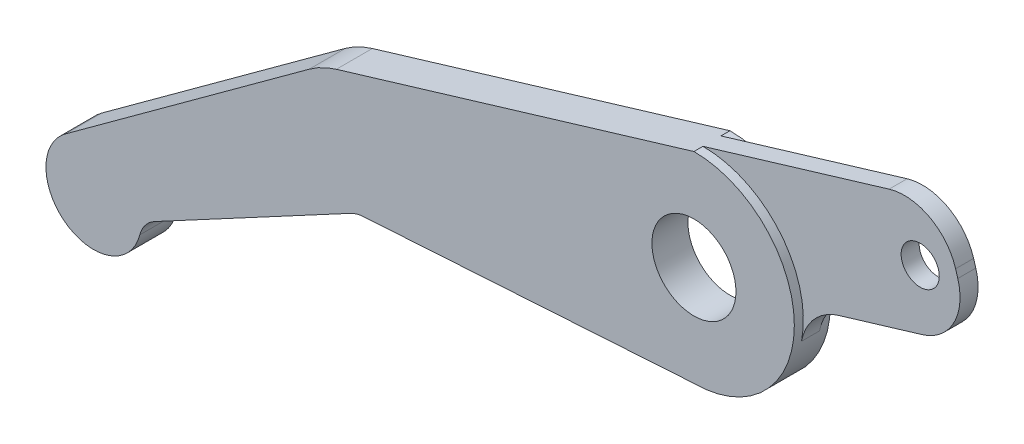
ISO-10303-21;
HEADER;
FILE_DESCRIPTION(('STEP AP214'),'2;1');
FILE_NAME('part.step','',(''),(''),'','','');
FILE_SCHEMA(('AUTOMOTIVE_DESIGN { 1 0 10303 214 1 1 1 1 }'));
ENDSEC;
DATA;
#1=APPLICATION_CONTEXT('core data for automotive mechanical design processes');
#2=APPLICATION_PROTOCOL_DEFINITION('international standard','automotive_design',2000,#1);
#3=PRODUCT_CONTEXT('',#1,'mechanical');
#4=PRODUCT('Part','Part','',(#3));
#5=PRODUCT_RELATED_PRODUCT_CATEGORY('part','',(#4));
#6=PRODUCT_DEFINITION_FORMATION('','',#4);
#7=PRODUCT_DEFINITION_CONTEXT('part definition',#1,'design');
#8=PRODUCT_DEFINITION('design','',#6,#7);
#9=PRODUCT_DEFINITION_SHAPE('','',#8);
#10=(LENGTH_UNIT() NAMED_UNIT(*) SI_UNIT(.MILLI.,.METRE.));
#11=(NAMED_UNIT(*) PLANE_ANGLE_UNIT() SI_UNIT($,.RADIAN.));
#12=(NAMED_UNIT(*) SI_UNIT($,.STERADIAN.) SOLID_ANGLE_UNIT());
#13=UNCERTAINTY_MEASURE_WITH_UNIT(LENGTH_MEASURE(1.E-05),#10,'distance_accuracy_value','');
#14=(GEOMETRIC_REPRESENTATION_CONTEXT(3) GLOBAL_UNCERTAINTY_ASSIGNED_CONTEXT((#13)) GLOBAL_UNIT_ASSIGNED_CONTEXT((#10,
#11,#12)) REPRESENTATION_CONTEXT('',''));
#15=CARTESIAN_POINT('',(0.,0.,0.));
#16=DIRECTION('',(0.,0.,1.));
#17=DIRECTION('',(1.,0.,0.));
#18=AXIS2_PLACEMENT_3D('',#15,#16,#17);
#19=CARTESIAN_POINT('',(209.329721991349,62.9722265592781,-9.));
#20=DIRECTION('',(-0.95760779883503,-0.288075170069079,0.));
#21=DIRECTION('',(0.288075170069079,-0.95760779883503,0.));
#22=AXIS2_PLACEMENT_3D('',#19,#20,#21);
#23=PLANE('',#22);
#24=DIRECTION('',(-0.288075170069078,0.95760779883503,0.));
#25=VECTOR('',#24,1.);
#26=CARTESIAN_POINT('',(197.350338288262,102.793608098558,-3.));
#27=LINE('',#26,#25);
#28=CARTESIAN_POINT('',(197.350338288262,102.793608098558,-3.));
#29=VERTEX_POINT('',#28);
#30=CARTESIAN_POINT('',(196.618627356287,105.225931907599,-3.));
#31=VERTEX_POINT('',#30);
#32=EDGE_CURVE('E261',#29,#31,#27,.T.);
#33=ORIENTED_EDGE('',*,*,#32,.F.);
#34=DIRECTION('',(0.,0.,1.));
#35=VECTOR('',#34,1.);
#36=CARTESIAN_POINT('',(197.350338288262,102.793608098558,-9.));
#37=LINE('',#36,#35);
#38=CARTESIAN_POINT('',(197.350338288262,102.793608098558,-9.));
#39=VERTEX_POINT('',#38);
#40=EDGE_CURVE('E229',#29,#39,#37,.F.);
#41=ORIENTED_EDGE('',*,*,#40,.T.);
#42=DIRECTION('',(0.28807517006908,-0.95760779883503,0.));
#43=VECTOR('',#42,1.);
#44=CARTESIAN_POINT('',(209.329721991349,62.9722265592781,-9.));
#45=LINE('',#44,#43);
#46=CARTESIAN_POINT('',(196.618627356287,105.225931907599,-9.));
#47=VERTEX_POINT('',#46);
#48=EDGE_CURVE('E246',#47,#39,#45,.T.);
#49=ORIENTED_EDGE('',*,*,#48,.F.);
#50=DIRECTION('',(0.,0.,1.));
#51=VECTOR('',#50,1.);
#52=CARTESIAN_POINT('',(196.618627356287,105.225931907599,-9.));
#53=LINE('',#52,#51);
#54=EDGE_CURVE('E232',#47,#31,#53,.T.);
#55=ORIENTED_EDGE('',*,*,#54,.T.);
#56=EDGE_LOOP('',(#33,#41,#49,#55));
#57=FACE_BOUND('',#56,.T.);
#58=ADVANCED_FACE('F73',(#57),#23,.F.);
#59=CARTESIAN_POINT('',(-6.85740717925912,22.7951148759929,-9.));
#60=DIRECTION('',(-0.28807517006908,0.95760779883503,0.));
#61=DIRECTION('',(-0.95760779883503,-0.28807517006908,0.));
#62=AXIS2_PLACEMENT_3D('',#59,#60,#61);
#63=PLANE('',#62);
#64=DIRECTION('',(0.95760779883503,0.28807517006908,0.));
#65=VECTOR('',#64,1.);
#66=CARTESIAN_POINT('',(157.613182204161,72.2724615158491,-3.));
#67=LINE('',#66,#65);
#68=CARTESIAN_POINT('',(157.613182204161,72.2724615158491,-3.));
#69=VERTEX_POINT('',#68);
#70=CARTESIAN_POINT('',(185.446048148803,80.6453649114428,-3.));
#71=VERTEX_POINT('',#70);
#72=EDGE_CURVE('E89',#69,#71,#67,.T.);
#73=ORIENTED_EDGE('',*,*,#72,.F.);
#74=DIRECTION('',(0.,0.,1.));
#75=VECTOR('',#74,1.);
#76=CARTESIAN_POINT('',(157.613182204161,72.2724615158491,-9.));
#77=LINE('',#76,#75);
#78=CARTESIAN_POINT('',(157.613182204161,72.2724615158491,-9.));
#79=VERTEX_POINT('',#78);
#80=EDGE_CURVE('E206',#69,#79,#77,.F.);
#81=ORIENTED_EDGE('',*,*,#80,.T.);
#82=DIRECTION('',(-0.95760779883503,-0.28807517006908,0.));
#83=VECTOR('',#82,1.);
#84=CARTESIAN_POINT('',(-6.85740717925912,22.7951148759929,-9.));
#85=LINE('',#84,#83);
#86=CARTESIAN_POINT('',(185.446048148803,80.6453649114428,-9.));
#87=VERTEX_POINT('',#86);
#88=EDGE_CURVE('E284',#87,#79,#85,.T.);
#89=ORIENTED_EDGE('',*,*,#88,.F.);
#90=DIRECTION('',(0.,0.,1.));
#91=VECTOR('',#90,1.);
#92=CARTESIAN_POINT('',(185.446048148803,80.6453649114428,-9.));
#93=LINE('',#92,#91);
#94=EDGE_CURVE('E213',#87,#71,#93,.T.);
#95=ORIENTED_EDGE('',*,*,#94,.T.);
#96=EDGE_LOOP('',(#73,#81,#89,#95));
#97=FACE_BOUND('',#96,.T.);
#98=ADVANCED_FACE('F418',(#97),#63,.F.);
#99=CARTESIAN_POINT('',(184.822863777069,100.351215343201,-9.));
#100=DIRECTION('',(0.,0.,1.));
#101=DIRECTION('',(1.,0.,0.));
#102=AXIS2_PLACEMENT_3D('',#99,#100,#101);
#103=CYLINDRICAL_SURFACE('',#102,6.34999999999999);
#104=CARTESIAN_POINT('',(184.822863777069,100.351215343201,-9.));
#105=DIRECTION('',(0.,0.,1.));
#106=DIRECTION('',(1.,0.,0.));
#107=AXIS2_PLACEMENT_3D('',#104,#105,#106);
#108=CIRCLE('',#107,6.34999999999999);
#109=CARTESIAN_POINT('',(191.172863777069,100.351215343201,-9.));
#110=VERTEX_POINT('',#109);
#111=EDGE_CURVE('E255',#110,#110,#108,.T.);
#112=ORIENTED_EDGE('',*,*,#111,.F.);
#113=EDGE_LOOP('',(#112));
#114=FACE_BOUND('',#113,.T.);
#115=CARTESIAN_POINT('',(184.822863777069,100.351215343201,-3.));
#116=DIRECTION('',(0.,0.,1.));
#117=DIRECTION('',(1.,0.,0.));
#118=AXIS2_PLACEMENT_3D('',#115,#116,#117);
#119=CIRCLE('',#118,6.34999999999999);
#120=CARTESIAN_POINT('',(191.172863777069,100.351215343201,-3.));
#121=VERTEX_POINT('',#120);
#122=EDGE_CURVE('E273',#121,#121,#119,.F.);
#123=ORIENTED_EDGE('',*,*,#122,.F.);
#124=EDGE_LOOP('',(#123));
#125=FACE_BOUND('',#124,.T.);
#126=ADVANCED_FACE('F423',(#114,#125),#103,.F.);
#127=CARTESIAN_POINT('',(162.735158727989,55.2461948525623,-12.));
#128=DIRECTION('',(0.,0.,1.));
#129=DIRECTION('',(1.,0.,0.));
#130=AXIS2_PLACEMENT_3D('',#127,#128,#129);
#131=CYLINDRICAL_SURFACE('',#130,17.78);
#132=CARTESIAN_POINT('',(162.735158727989,55.2461948525623,-3.));
#133=DIRECTION('',(0.,0.,-1.));
#134=DIRECTION('',(1.,0.,0.));
#135=AXIS2_PLACEMENT_3D('',#132,#133,#134);
#136=CIRCLE('',#135,17.78);
#137=CARTESIAN_POINT('',(145.281823298338,58.6387576567125,-3.));
#138=VERTEX_POINT('',#137);
#139=EDGE_CURVE('E192',#138,#69,#136,.T.);
#140=ORIENTED_EDGE('',*,*,#139,.F.);
#141=DIRECTION('',(0.,0.,1.));
#142=VECTOR('',#141,1.);
#143=CARTESIAN_POINT('',(145.281823298338,58.6387576567125,-12.));
#144=LINE('',#143,#142);
#145=CARTESIAN_POINT('',(145.281823298338,58.6387576567125,-9.));
#146=VERTEX_POINT('',#145);
#147=EDGE_CURVE('E205',#146,#138,#144,.T.);
#148=ORIENTED_EDGE('',*,*,#147,.F.);
#149=CARTESIAN_POINT('',(162.735158727989,55.2461948525623,-9.));
#150=DIRECTION('',(0.,0.,1.));
#151=DIRECTION('',(1.,0.,0.));
#152=AXIS2_PLACEMENT_3D('',#149,#150,#151);
#153=CIRCLE('',#152,17.78);
#154=EDGE_CURVE('E12',#79,#146,#153,.T.);
#155=ORIENTED_EDGE('',*,*,#154,.F.);
#156=ORIENTED_EDGE('',*,*,#80,.F.);
#157=EDGE_LOOP('',(#140,#148,#155,#156));
#158=FACE_BOUND('',#157,.T.);
#159=ADVANCED_FACE('F203',(#158),#131,.F.);
#160=CARTESIAN_POINT('',(179.592360693,100.103955383771,-9.));
#161=DIRECTION('',(0.,0.,1.));
#162=DIRECTION('',(1.,0.,0.));
#163=AXIS2_PLACEMENT_3D('',#160,#161,#162);
#164=CYLINDRICAL_SURFACE('',#163,17.78);
#165=DIRECTION('',(0.,0.,1.));
#166=VECTOR('',#165,1.);
#167=CARTESIAN_POINT('',(174.470384169171,117.130222047057,-12.));
#168=LINE('',#167,#166);
#169=CARTESIAN_POINT('',(174.470384169171,117.130222047057,-3.));
#170=VERTEX_POINT('',#169);
#171=CARTESIAN_POINT('',(174.470384169171,117.130222047057,-9.));
#172=VERTEX_POINT('',#171);
#173=EDGE_CURVE('E97',#170,#172,#168,.F.);
#174=ORIENTED_EDGE('',*,*,#173,.F.);
#175=CARTESIAN_POINT('',(179.592360693,100.103955383771,-3.));
#176=DIRECTION('',(0.,0.,1.));
#177=DIRECTION('',(1.,0.,0.));
#178=AXIS2_PLACEMENT_3D('',#175,#176,#177);
#179=CIRCLE('',#178,17.78);
#180=EDGE_CURVE('E259',#31,#170,#179,.T.);
#181=ORIENTED_EDGE('',*,*,#180,.F.);
#182=ORIENTED_EDGE('',*,*,#54,.F.);
#183=CARTESIAN_POINT('',(179.592360693,100.103955383771,-9.));
#184=DIRECTION('',(0.,0.,1.));
#185=DIRECTION('',(1.,0.,0.));
#186=AXIS2_PLACEMENT_3D('',#183,#184,#185);
#187=CIRCLE('',#186,17.78);
#188=EDGE_CURVE('E82',#172,#47,#187,.F.);
#189=ORIENTED_EDGE('',*,*,#188,.F.);
#190=EDGE_LOOP('',(#174,#181,#182,#189));
#191=FACE_BOUND('',#190,.T.);
#192=ADVANCED_FACE('F258',(#191),#164,.T.);
#193=CARTESIAN_POINT('',(180.324071624975,97.6716315747297,-9.));
#194=DIRECTION('',(0.,0.,1.));
#195=DIRECTION('',(1.,0.,0.));
#196=AXIS2_PLACEMENT_3D('',#193,#194,#195);
#197=CYLINDRICAL_SURFACE('',#196,17.78);
#198=ORIENTED_EDGE('',*,*,#40,.F.);
#199=CARTESIAN_POINT('',(180.324071624975,97.6716315747297,-3.));
#200=DIRECTION('',(0.,0.,1.));
#201=DIRECTION('',(1.,0.,0.));
#202=AXIS2_PLACEMENT_3D('',#199,#200,#201);
#203=CIRCLE('',#202,17.78);
#204=EDGE_CURVE('E267',#71,#29,#203,.T.);
#205=ORIENTED_EDGE('',*,*,#204,.F.);
#206=ORIENTED_EDGE('',*,*,#94,.F.);
#207=CARTESIAN_POINT('',(180.324071624975,97.6716315747297,-9.));
#208=DIRECTION('',(0.,0.,1.));
#209=DIRECTION('',(1.,0.,0.));
#210=AXIS2_PLACEMENT_3D('',#207,#208,#209);
#211=CIRCLE('',#210,17.78);
#212=EDGE_CURVE('E238',#39,#87,#211,.F.);
#213=ORIENTED_EDGE('',*,*,#212,.F.);
#214=EDGE_LOOP('',(#198,#205,#206,#213));
#215=FACE_BOUND('',#214,.T.);
#216=ADVANCED_FACE('F75',(#215),#197,.T.);
#217=CARTESIAN_POINT('',(112.446127038627,65.0213291845494,-12.));
#218=DIRECTION('',(0.,0.,1.));
#219=DIRECTION('',(1.,0.,0.));
#220=AXIS2_PLACEMENT_3D('',#217,#218,#219);
#221=CYLINDRICAL_SURFACE('',#220,33.4502640971339);
#222=CARTESIAN_POINT('',(112.446127038627,65.0213291845494,-9.));
#223=DIRECTION('',(0.,0.,1.));
#224=DIRECTION('',(1.,0.,0.));
#225=AXIS2_PLACEMENT_3D('',#222,#223,#224);
#226=CIRCLE('',#225,33.4502640971339);
#227=CARTESIAN_POINT('',(112.446127038627,98.4715932816832,-9.));
#228=VERTEX_POINT('',#227);
#229=EDGE_CURVE('E211',#146,#228,#226,.T.);
#230=ORIENTED_EDGE('',*,*,#229,.F.);
#231=ORIENTED_EDGE('',*,*,#147,.T.);
#232=CARTESIAN_POINT('',(112.446127038627,65.0213291845494,-3.));
#233=DIRECTION('',(0.,0.,-1.));
#234=DIRECTION('',(1.,0.,0.));
#235=AXIS2_PLACEMENT_3D('',#232,#233,#234);
#236=CIRCLE('',#235,33.4502640971338);
#237=CARTESIAN_POINT('',(112.446127038627,98.4715932816832,-3.));
#238=VERTEX_POINT('',#237);
#239=EDGE_CURVE('E188',#238,#138,#236,.T.);
#240=ORIENTED_EDGE('',*,*,#239,.F.);
#241=DIRECTION('',(0.,0.,1.));
#242=VECTOR('',#241,1.);
#243=CARTESIAN_POINT('',(112.446127038627,98.4715932816832,-3.));
#244=LINE('',#243,#242);
#245=CARTESIAN_POINT('',(112.446127038627,98.4715932816832,0.));
#246=VERTEX_POINT('',#245);
#247=EDGE_CURVE('E265',#238,#246,#244,.T.);
#248=ORIENTED_EDGE('',*,*,#247,.T.);
#249=CARTESIAN_POINT('',(112.446127038627,65.0213291845494,0.));
#250=DIRECTION('',(0.,0.,1.));
#251=DIRECTION('',(1.,0.,0.));
#252=AXIS2_PLACEMENT_3D('',#249,#250,#251);
#253=CIRCLE('',#252,33.4502640971339);
#254=CARTESIAN_POINT('',(112.446127038627,31.5710650874155,0.));
#255=VERTEX_POINT('',#254);
#256=EDGE_CURVE('E330',#255,#246,#253,.T.);
#257=ORIENTED_EDGE('',*,*,#256,.F.);
#258=DIRECTION('',(0.,0.,1.));
#259=VECTOR('',#258,1.);
#260=CARTESIAN_POINT('',(112.446127038627,31.5710650874155,-12.));
#261=LINE('',#260,#259);
#262=CARTESIAN_POINT('',(112.446127038627,31.5710650874155,-12.));
#263=VERTEX_POINT('',#262);
#264=EDGE_CURVE('E376',#263,#255,#261,.T.);
#265=ORIENTED_EDGE('',*,*,#264,.F.);
#266=CARTESIAN_POINT('',(112.446127038627,65.0213291845494,-12.));
#267=DIRECTION('',(0.,0.,1.));
#268=DIRECTION('',(1.,0.,0.));
#269=AXIS2_PLACEMENT_3D('',#266,#267,#268);
#270=CIRCLE('',#269,33.4502640971339);
#271=CARTESIAN_POINT('',(112.446127038627,98.4715932816832,-12.));
#272=VERTEX_POINT('',#271);
#273=EDGE_CURVE('E297',#263,#272,#270,.T.);
#274=ORIENTED_EDGE('',*,*,#273,.T.);
#275=DIRECTION('',(0.,0.,1.));
#276=VECTOR('',#275,1.);
#277=CARTESIAN_POINT('',(112.446127038627,98.4715932816832,-12.));
#278=LINE('',#277,#276);
#279=EDGE_CURVE('E374',#272,#228,#278,.T.);
#280=ORIENTED_EDGE('',*,*,#279,.T.);
#281=EDGE_LOOP('',(#230,#231,#240,#248,#257,#265,#274,#280));
#282=FACE_BOUND('',#281,.T.);
#283=ADVANCED_FACE('F209',(#282),#221,.T.);
#284=CARTESIAN_POINT('',(2.80654719042014,14.6252686027096,-12.));
#285=DIRECTION('',(0.,0.,1.));
#286=DIRECTION('',(1.,0.,0.));
#287=AXIS2_PLACEMENT_3D('',#284,#285,#286);
#288=CYLINDRICAL_SURFACE('',#287,10.0075999999999);
#289=CARTESIAN_POINT('',(2.80654719042014,14.6252686027096,0.));
#290=DIRECTION('',(0.,0.,1.));
#291=DIRECTION('',(1.,0.,0.));
#292=AXIS2_PLACEMENT_3D('',#289,#290,#291);
#293=CIRCLE('',#292,10.0075999999999);
#294=CARTESIAN_POINT('',(2.17631782892728,24.6130045179163,0.));
#295=VERTEX_POINT('',#294);
#296=CARTESIAN_POINT('',(-1.92188851234106,23.4453566728397,0.));
#297=VERTEX_POINT('',#296);
#298=EDGE_CURVE('E288',#295,#297,#293,.T.);
#299=ORIENTED_EDGE('',*,*,#298,.T.);
#300=DIRECTION('',(0.,0.,1.));
#301=VECTOR('',#300,1.);
#302=CARTESIAN_POINT('',(-1.92188851234106,23.4453566728397,-12.));
#303=LINE('',#302,#301);
#304=CARTESIAN_POINT('',(-1.92188851234106,23.4453566728397,-12.));
#305=VERTEX_POINT('',#304);
#306=EDGE_CURVE('E214',#305,#297,#303,.T.);
#307=ORIENTED_EDGE('',*,*,#306,.F.);
#308=CARTESIAN_POINT('',(2.80654719042014,14.6252686027096,-12.));
#309=DIRECTION('',(0.,0.,1.));
#310=DIRECTION('',(1.,0.,0.));
#311=AXIS2_PLACEMENT_3D('',#308,#309,#310);
#312=CIRCLE('',#311,10.0075999999999);
#313=CARTESIAN_POINT('',(2.17631782892728,24.6130045179163,-12.));
#314=VERTEX_POINT('',#313);
#315=EDGE_CURVE('E289',#314,#305,#312,.T.);
#316=ORIENTED_EDGE('',*,*,#315,.F.);
#317=DIRECTION('',(0.,0.,1.));
#318=VECTOR('',#317,1.);
#319=CARTESIAN_POINT('',(2.17631782892728,24.6130045179163,-12.));
#320=LINE('',#319,#318);
#321=EDGE_CURVE('E224',#314,#295,#320,.T.);
#322=ORIENTED_EDGE('',*,*,#321,.T.);
#323=EDGE_LOOP('',(#299,#307,#316,#322));
#324=FACE_BOUND('',#323,.T.);
#325=ADVANCED_FACE('F387',(#324),#288,.F.);
#326=CARTESIAN_POINT('',(-10.1921373240404,19.011688954216,-12.));
#327=DIRECTION('',(-0.472484482069713,0.881338989381109,0.));
#328=DIRECTION('',(-0.881338989381109,-0.472484482069713,0.));
#329=AXIS2_PLACEMENT_3D('',#326,#327,#328);
#330=PLANE('',#329);
#331=DIRECTION('',(-0.881338989381109,-0.472484482069713,0.));
#332=VECTOR('',#331,1.);
#333=CARTESIAN_POINT('',(-10.1921373240404,19.011688954216,0.));
#334=LINE('',#333,#332);
#335=CARTESIAN_POINT('',(-67.2042475557879,-11.552416003247,0.));
#336=VERTEX_POINT('',#335);
#337=EDGE_CURVE('E351',#297,#336,#334,.T.);
#338=ORIENTED_EDGE('',*,*,#337,.T.);
#339=DIRECTION('',(0.,0.,1.));
#340=VECTOR('',#339,1.);
#341=CARTESIAN_POINT('',(-67.2042475557879,-11.552416003247,-12.));
#342=LINE('',#341,#340);
#343=CARTESIAN_POINT('',(-67.2042475557879,-11.552416003247,-12.));
#344=VERTEX_POINT('',#343);
#345=EDGE_CURVE('E221',#344,#336,#342,.T.);
#346=ORIENTED_EDGE('',*,*,#345,.F.);
#347=DIRECTION('',(-0.881338989381109,-0.472484482069713,0.));
#348=VECTOR('',#347,1.);
#349=CARTESIAN_POINT('',(-10.1921373240404,19.011688954216,-12.));
#350=LINE('',#349,#348);
#351=EDGE_CURVE('E317',#305,#344,#350,.T.);
#352=ORIENTED_EDGE('',*,*,#351,.F.);
#353=ORIENTED_EDGE('',*,*,#306,.T.);
#354=EDGE_LOOP('',(#338,#346,#352,#353));
#355=FACE_BOUND('',#354,.T.);
#356=ADVANCED_FACE('F396',(#355),#330,.F.);
#357=CARTESIAN_POINT('',(-62.4758118530267,-20.3725040733778,-12.));
#358=DIRECTION('',(0.,0.,1.));
#359=DIRECTION('',(1.,0.,0.));
#360=AXIS2_PLACEMENT_3D('',#357,#358,#359);
#361=CYLINDRICAL_SURFACE('',#360,10.0076000000006);
#362=CARTESIAN_POINT('',(-62.4758118530267,-20.3725040733778,0.));
#363=DIRECTION('',(0.,0.,1.));
#364=DIRECTION('',(1.,0.,0.));
#365=AXIS2_PLACEMENT_3D('',#362,#363,#364);
#366=CIRCLE('',#365,10.0076000000006);
#367=CARTESIAN_POINT('',(-72.1703827482878,-17.8890884986567,0.));
#368=VERTEX_POINT('',#367);
#369=EDGE_CURVE('E347',#336,#368,#366,.T.);
#370=ORIENTED_EDGE('',*,*,#369,.T.);
#371=DIRECTION('',(0.,0.,1.));
#372=VECTOR('',#371,1.);
#373=CARTESIAN_POINT('',(-72.1703827482878,-17.8890884986567,-12.));
#374=LINE('',#373,#372);
#375=CARTESIAN_POINT('',(-72.1703827482878,-17.8890884986567,-12.));
#376=VERTEX_POINT('',#375);
#377=EDGE_CURVE('E360',#376,#368,#374,.T.);
#378=ORIENTED_EDGE('',*,*,#377,.F.);
#379=CARTESIAN_POINT('',(-62.4758118530267,-20.3725040733778,-12.));
#380=DIRECTION('',(0.,0.,1.));
#381=DIRECTION('',(1.,0.,0.));
#382=AXIS2_PLACEMENT_3D('',#379,#380,#381);
#383=CIRCLE('',#382,10.0076000000006);
#384=EDGE_CURVE('E314',#344,#376,#383,.T.);
#385=ORIENTED_EDGE('',*,*,#384,.F.);
#386=ORIENTED_EDGE('',*,*,#345,.T.);
#387=EDGE_LOOP('',(#370,#378,#385,#386));
#388=FACE_BOUND('',#387,.T.);
#389=ADVANCED_FACE('F437',(#388),#361,.F.);
#390=CARTESIAN_POINT('',(-87.5534729613731,-13.9484699570777,-12.));
#391=DIRECTION('',(0.,0.,1.));
#392=DIRECTION('',(1.,0.,0.));
#393=AXIS2_PLACEMENT_3D('',#390,#391,#392);
#394=CYLINDRICAL_SURFACE('',#393,15.8797965665231);
#395=CARTESIAN_POINT('',(-87.5534729613731,-13.9484699570777,0.));
#396=DIRECTION('',(0.,0.,1.));
#397=DIRECTION('',(1.,0.,0.));
#398=AXIS2_PLACEMENT_3D('',#395,#396,#397);
#399=CIRCLE('',#398,15.8797965665231);
#400=CARTESIAN_POINT('',(-96.91554928021,-1.1219557776745,0.));
#401=VERTEX_POINT('',#400);
#402=EDGE_CURVE('E343',#401,#368,#399,.T.);
#403=ORIENTED_EDGE('',*,*,#402,.F.);
#404=DIRECTION('',(0.,0.,1.));
#405=VECTOR('',#404,1.);
#406=CARTESIAN_POINT('',(-96.91554928021,-1.1219557776745,-12.));
#407=LINE('',#406,#405);
#408=CARTESIAN_POINT('',(-96.91554928021,-1.1219557776745,-12.));
#409=VERTEX_POINT('',#408);
#410=EDGE_CURVE('E363',#409,#401,#407,.T.);
#411=ORIENTED_EDGE('',*,*,#410,.F.);
#412=CARTESIAN_POINT('',(-87.5534729613731,-13.9484699570777,-12.));
#413=DIRECTION('',(0.,0.,1.));
#414=DIRECTION('',(1.,0.,0.));
#415=AXIS2_PLACEMENT_3D('',#412,#413,#414);
#416=CIRCLE('',#415,15.8797965665231);
#417=EDGE_CURVE('E310',#409,#376,#416,.T.);
#418=ORIENTED_EDGE('',*,*,#417,.T.);
#419=ORIENTED_EDGE('',*,*,#377,.T.);
#420=EDGE_LOOP('',(#403,#411,#418,#419));
#421=FACE_BOUND('',#420,.T.);
#422=ADVANCED_FACE('F440',(#421),#394,.T.);
#423=CARTESIAN_POINT('',(-33.1516065888726,45.419363985168,-12.));
#424=DIRECTION('',(0.589558958114959,-0.807725346207735,0.));
#425=DIRECTION('',(0.807725346207735,0.589558958114959,0.));
#426=AXIS2_PLACEMENT_3D('',#423,#424,#425);
#427=PLANE('',#426);
#428=DIRECTION('',(0.807725346207734,0.589558958114959,0.));
#429=VECTOR('',#428,1.);
#430=CARTESIAN_POINT('',(-33.1516065888726,45.419363985168,0.));
#431=LINE('',#430,#429);
#432=CARTESIAN_POINT('',(-15.7223999361191,58.1409468390567,0.));
#433=VERTEX_POINT('',#432);
#434=EDGE_CURVE('E340',#401,#433,#431,.T.);
#435=ORIENTED_EDGE('',*,*,#434,.T.);
#436=DIRECTION('',(0.,0.,1.));
#437=VECTOR('',#436,1.);
#438=CARTESIAN_POINT('',(-15.7223999361191,58.1409468390567,-12.));
#439=LINE('',#438,#437);
#440=CARTESIAN_POINT('',(-15.7223999361191,58.1409468390567,-12.));
#441=VERTEX_POINT('',#440);
#442=EDGE_CURVE('E366',#441,#433,#439,.T.);
#443=ORIENTED_EDGE('',*,*,#442,.F.);
#444=DIRECTION('',(0.807725346207734,0.589558958114959,0.));
#445=VECTOR('',#444,1.);
#446=CARTESIAN_POINT('',(-33.1516065888726,45.419363985168,-12.));
#447=LINE('',#446,#445);
#448=EDGE_CURVE('E307',#409,#441,#447,.T.);
#449=ORIENTED_EDGE('',*,*,#448,.F.);
#450=ORIENTED_EDGE('',*,*,#410,.T.);
#451=EDGE_LOOP('',(#435,#443,#449,#450));
#452=FACE_BOUND('',#451,.T.);
#453=ADVANCED_FACE('F444',(#452),#427,.F.);
#454=CARTESIAN_POINT('',(1.94786115650241,33.9318027625185,-12.));
#455=DIRECTION('',(0.,0.,1.));
#456=DIRECTION('',(1.,0.,0.));
#457=AXIS2_PLACEMENT_3D('',#454,#455,#456);
#458=CYLINDRICAL_SURFACE('',#457,29.972);
#459=CARTESIAN_POINT('',(1.94786115650241,33.9318027625185,0.));
#460=DIRECTION('',(0.,0.,1.));
#461=DIRECTION('',(1.,0.,0.));
#462=AXIS2_PLACEMENT_3D('',#459,#460,#461);
#463=CIRCLE('',#462,29.972);
#464=CARTESIAN_POINT('',(-6.68632784080793,62.633223709202,0.));
#465=VERTEX_POINT('',#464);
#466=EDGE_CURVE('E337',#433,#465,#463,.F.);
#467=ORIENTED_EDGE('',*,*,#466,.T.);
#468=DIRECTION('',(0.,0.,1.));
#469=VECTOR('',#468,1.);
#470=CARTESIAN_POINT('',(-6.68632784080793,62.633223709202,-12.));
#471=LINE('',#470,#469);
#472=CARTESIAN_POINT('',(-6.68632784080793,62.633223709202,-12.));
#473=VERTEX_POINT('',#472);
#474=EDGE_CURVE('E370',#473,#465,#471,.T.);
#475=ORIENTED_EDGE('',*,*,#474,.F.);
#476=CARTESIAN_POINT('',(1.94786115650241,33.9318027625185,-12.));
#477=DIRECTION('',(0.,0.,1.));
#478=DIRECTION('',(1.,0.,0.));
#479=AXIS2_PLACEMENT_3D('',#476,#477,#478);
#480=CIRCLE('',#479,29.972);
#481=EDGE_CURVE('E304',#441,#473,#480,.F.);
#482=ORIENTED_EDGE('',*,*,#481,.F.);
#483=ORIENTED_EDGE('',*,*,#442,.T.);
#484=EDGE_LOOP('',(#467,#475,#482,#483));
#485=FACE_BOUND('',#484,.T.);
#486=ADVANCED_FACE('F413',(#485),#458,.T.);
#487=CARTESIAN_POINT('',(-17.8330711588911,59.2799720116076,-12.));
#488=DIRECTION('',(0.288075170069079,-0.95760779883503,0.));
#489=DIRECTION('',(0.95760779883503,0.28807517006908,0.));
#490=AXIS2_PLACEMENT_3D('',#487,#488,#489);
#491=PLANE('',#490);
#492=DIRECTION('',(0.95760779883503,0.288075170069079,0.));
#493=VECTOR('',#492,1.);
#494=CARTESIAN_POINT('',(-17.8330711588911,59.2799720116076,0.));
#495=LINE('',#494,#493);
#496=EDGE_CURVE('E333',#465,#246,#495,.T.);
#497=ORIENTED_EDGE('',*,*,#496,.T.);
#498=ORIENTED_EDGE('',*,*,#247,.F.);
#499=DIRECTION('',(-0.95760779883503,-0.28807517006908,0.));
#500=VECTOR('',#499,1.);
#501=CARTESIAN_POINT('',(174.470384169171,117.130222047057,-3.));
#502=LINE('',#501,#500);
#503=EDGE_CURVE('E193',#170,#238,#502,.T.);
#504=ORIENTED_EDGE('',*,*,#503,.F.);
#505=ORIENTED_EDGE('',*,*,#173,.T.);
#506=DIRECTION('',(0.95760779883503,0.288075170069079,0.));
#507=VECTOR('',#506,1.);
#508=CARTESIAN_POINT('',(-17.8330711588911,59.2799720116078,-9.));
#509=LINE('',#508,#507);
#510=EDGE_CURVE('E248',#228,#172,#509,.T.);
#511=ORIENTED_EDGE('',*,*,#510,.F.);
#512=ORIENTED_EDGE('',*,*,#279,.F.);
#513=DIRECTION('',(0.95760779883503,0.288075170069079,0.));
#514=VECTOR('',#513,1.);
#515=CARTESIAN_POINT('',(-17.8330711588911,59.2799720116076,-12.));
#516=LINE('',#515,#514);
#517=EDGE_CURVE('E301',#473,#272,#516,.T.);
#518=ORIENTED_EDGE('',*,*,#517,.F.);
#519=ORIENTED_EDGE('',*,*,#474,.T.);
#520=EDGE_LOOP('',(#497,#498,#504,#505,#511,#512,#518,#519));
#521=FACE_BOUND('',#520,.T.);
#522=ADVANCED_FACE('F405',(#521),#491,.F.);
#523=CARTESIAN_POINT('',(-1.53829822929689,24.3786110451172,-12.));
#524=DIRECTION('',(-0.0629750750922182,0.998015100044648,0.));
#525=DIRECTION('',(-0.998015100044649,-0.0629750750922182,0.));
#526=AXIS2_PLACEMENT_3D('',#523,#524,#525);
#527=PLANE('',#526);
#528=DIRECTION('',(-0.998015100044649,-0.0629750750922182,0.));
#529=VECTOR('',#528,1.);
#530=CARTESIAN_POINT('',(-1.53829822929689,24.3786110451172,0.));
#531=LINE('',#530,#529);
#532=EDGE_CURVE('E327',#255,#295,#531,.T.);
#533=ORIENTED_EDGE('',*,*,#532,.T.);
#534=ORIENTED_EDGE('',*,*,#321,.F.);
#535=DIRECTION('',(-0.998015100044649,-0.0629750750922182,0.));
#536=VECTOR('',#535,1.);
#537=CARTESIAN_POINT('',(-1.53829822929689,24.3786110451172,-12.));
#538=LINE('',#537,#536);
#539=EDGE_CURVE('E293',#263,#314,#538,.T.);
#540=ORIENTED_EDGE('',*,*,#539,.F.);
#541=ORIENTED_EDGE('',*,*,#264,.T.);
#542=EDGE_LOOP('',(#533,#534,#540,#541));
#543=FACE_BOUND('',#542,.T.);
#544=ADVANCED_FACE('F402',(#543),#527,.F.);
#545=CARTESIAN_POINT('',(112.446127038627,65.0213291845494,-12.));
#546=DIRECTION('',(0.,0.,1.));
#547=DIRECTION('',(1.,0.,0.));
#548=AXIS2_PLACEMENT_3D('',#545,#546,#547);
#549=CYLINDRICAL_SURFACE('',#548,14.);
#550=CARTESIAN_POINT('',(112.446127038627,65.0213291845494,-12.));
#551=DIRECTION('',(0.,0.,1.));
#552=DIRECTION('',(1.,0.,0.));
#553=AXIS2_PLACEMENT_3D('',#550,#551,#552);
#554=CIRCLE('',#553,14.);
#555=CARTESIAN_POINT('',(126.446127038627,65.0213291845494,-12.));
#556=VERTEX_POINT('',#555);
#557=EDGE_CURVE('E320',#556,#556,#554,.T.);
#558=ORIENTED_EDGE('',*,*,#557,.F.);
#559=EDGE_LOOP('',(#558));
#560=FACE_BOUND('',#559,.T.);
#561=CARTESIAN_POINT('',(112.446127038627,65.0213291845494,0.));
#562=DIRECTION('',(0.,0.,1.));
#563=DIRECTION('',(1.,0.,0.));
#564=AXIS2_PLACEMENT_3D('',#561,#562,#563);
#565=CIRCLE('',#564,14.);
#566=CARTESIAN_POINT('',(126.446127038627,65.0213291845494,0.));
#567=VERTEX_POINT('',#566);
#568=EDGE_CURVE('E294',#567,#567,#565,.T.);
#569=ORIENTED_EDGE('',*,*,#568,.T.);
#570=EDGE_LOOP('',(#569));
#571=FACE_BOUND('',#570,.T.);
#572=ADVANCED_FACE('F404',(#560,#571),#549,.F.);
#573=CARTESIAN_POINT('',(0.,0.,-12.));
#574=DIRECTION('',(0.,0.,1.));
#575=DIRECTION('',(1.,0.,0.));
#576=AXIS2_PLACEMENT_3D('',#573,#574,#575);
#577=PLANE('',#576);
#578=ORIENTED_EDGE('',*,*,#315,.T.);
#579=ORIENTED_EDGE('',*,*,#351,.T.);
#580=ORIENTED_EDGE('',*,*,#384,.T.);
#581=ORIENTED_EDGE('',*,*,#417,.F.);
#582=ORIENTED_EDGE('',*,*,#448,.T.);
#583=ORIENTED_EDGE('',*,*,#481,.T.);
#584=ORIENTED_EDGE('',*,*,#517,.T.);
#585=ORIENTED_EDGE('',*,*,#273,.F.);
#586=ORIENTED_EDGE('',*,*,#539,.T.);
#587=EDGE_LOOP('',(#578,#579,#580,#581,#582,#583,#584,#585,#586));
#588=FACE_BOUND('',#587,.T.);
#589=ORIENTED_EDGE('',*,*,#557,.T.);
#590=EDGE_LOOP('',(#589));
#591=FACE_BOUND('',#590,.T.);
#592=ADVANCED_FACE('F399',(#588,#591),#577,.F.);
#593=CARTESIAN_POINT('',(0.,0.,0.));
#594=DIRECTION('',(0.,0.,1.));
#595=DIRECTION('',(1.,0.,0.));
#596=AXIS2_PLACEMENT_3D('',#593,#594,#595);
#597=PLANE('',#596);
#598=ORIENTED_EDGE('',*,*,#256,.T.);
#599=ORIENTED_EDGE('',*,*,#496,.F.);
#600=ORIENTED_EDGE('',*,*,#466,.F.);
#601=ORIENTED_EDGE('',*,*,#434,.F.);
#602=ORIENTED_EDGE('',*,*,#402,.T.);
#603=ORIENTED_EDGE('',*,*,#369,.F.);
#604=ORIENTED_EDGE('',*,*,#337,.F.);
#605=ORIENTED_EDGE('',*,*,#298,.F.);
#606=ORIENTED_EDGE('',*,*,#532,.F.);
#607=EDGE_LOOP('',(#598,#599,#600,#601,#602,#603,#604,#605,#606));
#608=FACE_BOUND('',#607,.T.);
#609=ORIENTED_EDGE('',*,*,#568,.F.);
#610=EDGE_LOOP('',(#609));
#611=FACE_BOUND('',#610,.T.);
#612=ADVANCED_FACE('F390',(#608,#611),#597,.T.);
#613=CARTESIAN_POINT('',(0.,0.,-9.));
#614=DIRECTION('',(0.,0.,1.));
#615=DIRECTION('',(1.,0.,0.));
#616=AXIS2_PLACEMENT_3D('',#613,#614,#615);
#617=PLANE('',#616);
#618=ORIENTED_EDGE('',*,*,#111,.T.);
#619=EDGE_LOOP('',(#618));
#620=FACE_BOUND('',#619,.T.);
#621=ORIENTED_EDGE('',*,*,#510,.T.);
#622=ORIENTED_EDGE('',*,*,#188,.T.);
#623=ORIENTED_EDGE('',*,*,#48,.T.);
#624=ORIENTED_EDGE('',*,*,#212,.T.);
#625=ORIENTED_EDGE('',*,*,#88,.T.);
#626=ORIENTED_EDGE('',*,*,#154,.T.);
#627=ORIENTED_EDGE('',*,*,#229,.T.);
#628=EDGE_LOOP('',(#621,#622,#623,#624,#625,#626,#627));
#629=FACE_BOUND('',#628,.T.);
#630=ADVANCED_FACE('F245',(#620,#629),#617,.F.);
#631=CARTESIAN_POINT('',(112.446127038627,65.0213291845494,-3.));
#632=DIRECTION('',(0.,0.,1.));
#633=DIRECTION('',(1.,0.,0.));
#634=AXIS2_PLACEMENT_3D('',#631,#632,#633);
#635=PLANE('',#634);
#636=ORIENTED_EDGE('',*,*,#239,.T.);
#637=ORIENTED_EDGE('',*,*,#139,.T.);
#638=ORIENTED_EDGE('',*,*,#72,.T.);
#639=ORIENTED_EDGE('',*,*,#204,.T.);
#640=ORIENTED_EDGE('',*,*,#32,.T.);
#641=ORIENTED_EDGE('',*,*,#180,.T.);
#642=ORIENTED_EDGE('',*,*,#503,.T.);
#643=EDGE_LOOP('',(#636,#637,#638,#639,#640,#641,#642));
#644=FACE_BOUND('',#643,.T.);
#645=ORIENTED_EDGE('',*,*,#122,.T.);
#646=EDGE_LOOP('',(#645));
#647=FACE_BOUND('',#646,.T.);
#648=ADVANCED_FACE('F190',(#644,#647),#635,.T.);
#649=CLOSED_SHELL('',(#58,#98,#126,#159,#192,#216,#283,#325,#356,#389,#422,#453,#486,#522,#544,
#572,#592,#612,#630,#648));
#650=MANIFOLD_SOLID_BREP('B2',#649);
#651=ADVANCED_BREP_SHAPE_REPRESENTATION('',(#18,#650),#14);
#652=SHAPE_DEFINITION_REPRESENTATION(#9,#651);
ENDSEC;
END-ISO-10303-21;
